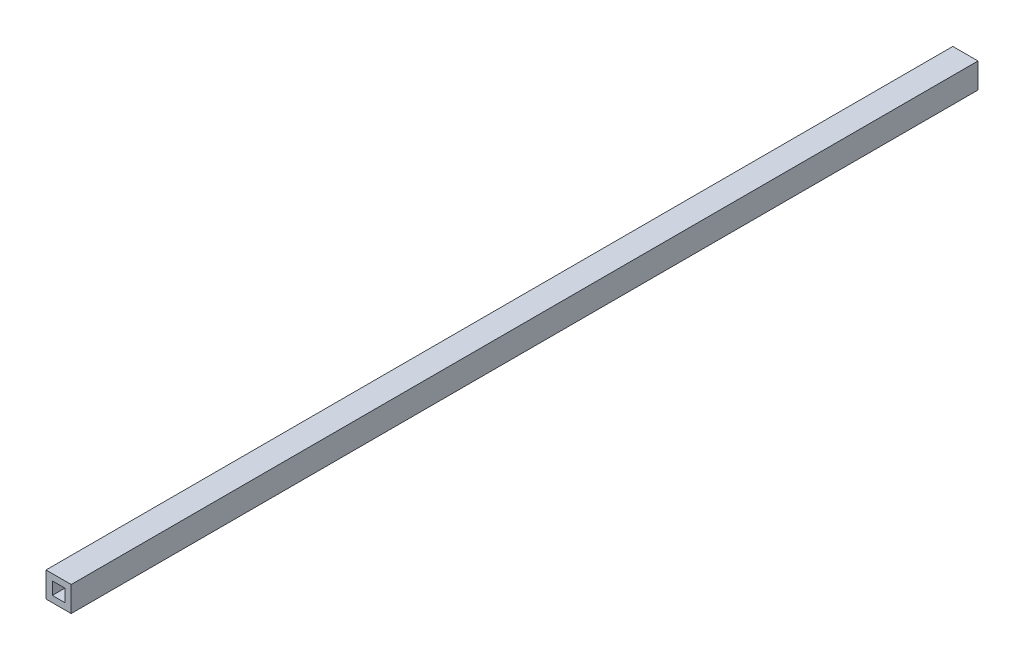
ISO-10303-21;
HEADER;
FILE_DESCRIPTION(('STEP AP214'),'2;1');
FILE_NAME('part.step','',(''),(''),'','','');
FILE_SCHEMA(('AUTOMOTIVE_DESIGN { 1 0 10303 214 1 1 1 1 }'));
ENDSEC;
DATA;
#1=APPLICATION_CONTEXT('core data for automotive mechanical design processes');
#2=APPLICATION_PROTOCOL_DEFINITION('international standard','automotive_design',2000,#1);
#3=PRODUCT_CONTEXT('',#1,'mechanical');
#4=PRODUCT('Part','Part','',(#3));
#5=PRODUCT_RELATED_PRODUCT_CATEGORY('part','',(#4));
#6=PRODUCT_DEFINITION_FORMATION('','',#4);
#7=PRODUCT_DEFINITION_CONTEXT('part definition',#1,'design');
#8=PRODUCT_DEFINITION('design','',#6,#7);
#9=PRODUCT_DEFINITION_SHAPE('','',#8);
#10=(LENGTH_UNIT() NAMED_UNIT(*) SI_UNIT(.MILLI.,.METRE.));
#11=(NAMED_UNIT(*) PLANE_ANGLE_UNIT() SI_UNIT($,.RADIAN.));
#12=(NAMED_UNIT(*) SI_UNIT($,.STERADIAN.) SOLID_ANGLE_UNIT());
#13=UNCERTAINTY_MEASURE_WITH_UNIT(LENGTH_MEASURE(1.E-05),#10,'distance_accuracy_value','');
#14=(GEOMETRIC_REPRESENTATION_CONTEXT(3) GLOBAL_UNCERTAINTY_ASSIGNED_CONTEXT((#13)) GLOBAL_UNIT_ASSIGNED_CONTEXT((#10,
#11,#12)) REPRESENTATION_CONTEXT('',''));
#15=CARTESIAN_POINT('',(0.,0.,0.));
#16=DIRECTION('',(0.,0.,1.));
#17=DIRECTION('',(1.,0.,0.));
#18=AXIS2_PLACEMENT_3D('',#15,#16,#17);
#19=CARTESIAN_POINT('',(25.4,-12.7000000000001,457.200000000001));
#20=DIRECTION('',(0.,0.,-1.));
#21=DIRECTION('',(-1.,0.,0.));
#22=AXIS2_PLACEMENT_3D('',#19,#20,#21);
#23=PLANE('',#22);
#24=DIRECTION('',(-1.,0.,0.));
#25=VECTOR('',#24,1.);
#26=CARTESIAN_POINT('',(6.35,6.35,457.200000000001));
#27=LINE('',#26,#25);
#28=CARTESIAN_POINT('',(19.05,6.35,457.200000000001));
#29=VERTEX_POINT('',#28);
#30=CARTESIAN_POINT('',(6.35,6.35,457.200000000001));
#31=VERTEX_POINT('',#30);
#32=EDGE_CURVE('E124',#29,#31,#27,.T.);
#33=ORIENTED_EDGE('',*,*,#32,.F.);
#34=DIRECTION('',(0.,1.,0.));
#35=VECTOR('',#34,1.);
#36=CARTESIAN_POINT('',(19.05,-6.35,457.200000000001));
#37=LINE('',#36,#35);
#38=CARTESIAN_POINT('',(19.05,-6.35,457.200000000001));
#39=VERTEX_POINT('',#38);
#40=EDGE_CURVE('E47',#39,#29,#37,.T.);
#41=ORIENTED_EDGE('',*,*,#40,.F.);
#42=DIRECTION('',(1.,0.,0.));
#43=VECTOR('',#42,1.);
#44=CARTESIAN_POINT('',(6.35,-6.35,457.200000000001));
#45=LINE('',#44,#43);
#46=CARTESIAN_POINT('',(6.35,-6.35,457.200000000001));
#47=VERTEX_POINT('',#46);
#48=EDGE_CURVE('E115',#47,#39,#45,.T.);
#49=ORIENTED_EDGE('',*,*,#48,.F.);
#50=DIRECTION('',(0.,-1.,0.));
#51=VECTOR('',#50,1.);
#52=CARTESIAN_POINT('',(6.35,-6.35,457.200000000001));
#53=LINE('',#52,#51);
#54=EDGE_CURVE('E118',#31,#47,#53,.T.);
#55=ORIENTED_EDGE('',*,*,#54,.F.);
#56=EDGE_LOOP('',(#33,#41,#49,#55));
#57=FACE_BOUND('',#56,.T.);
#58=DIRECTION('',(0.,-1.,0.));
#59=VECTOR('',#58,1.);
#60=CARTESIAN_POINT('',(0.,-12.7000000000001,457.200000000001));
#61=LINE('',#60,#59);
#62=CARTESIAN_POINT('',(0.,12.6999999999999,457.200000000001));
#63=VERTEX_POINT('',#62);
#64=CARTESIAN_POINT('',(0.,-12.7000000000001,457.200000000001));
#65=VERTEX_POINT('',#64);
#66=EDGE_CURVE('E130',#63,#65,#61,.T.);
#67=ORIENTED_EDGE('',*,*,#66,.T.);
#68=DIRECTION('',(-1.,0.,0.));
#69=VECTOR('',#68,1.);
#70=CARTESIAN_POINT('',(25.4,-12.7000000000001,457.200000000001));
#71=LINE('',#70,#69);
#72=CARTESIAN_POINT('',(25.4,-12.7000000000001,457.200000000001));
#73=VERTEX_POINT('',#72);
#74=EDGE_CURVE('E11',#73,#65,#71,.T.);
#75=ORIENTED_EDGE('',*,*,#74,.F.);
#76=DIRECTION('',(0.,-1.,0.));
#77=VECTOR('',#76,1.);
#78=CARTESIAN_POINT('',(25.4,-12.7000000000001,457.200000000001));
#79=LINE('',#78,#77);
#80=CARTESIAN_POINT('',(25.4,12.6999999999999,457.200000000001));
#81=VERTEX_POINT('',#80);
#82=EDGE_CURVE('E134',#81,#73,#79,.T.);
#83=ORIENTED_EDGE('',*,*,#82,.F.);
#84=DIRECTION('',(-1.,0.,0.));
#85=VECTOR('',#84,1.);
#86=CARTESIAN_POINT('',(25.4,12.6999999999999,457.200000000001));
#87=LINE('',#86,#85);
#88=EDGE_CURVE('E144',#81,#63,#87,.T.);
#89=ORIENTED_EDGE('',*,*,#88,.T.);
#90=EDGE_LOOP('',(#67,#75,#83,#89));
#91=FACE_BOUND('',#90,.T.);
#92=ADVANCED_FACE('F33',(#57,#91),#23,.F.);
#93=CARTESIAN_POINT('',(25.4,-12.6999999999999,-457.199999999999));
#94=DIRECTION('',(0.,1.,0.));
#95=DIRECTION('',(0.,0.,1.));
#96=AXIS2_PLACEMENT_3D('',#93,#94,#95);
#97=PLANE('',#96);
#98=DIRECTION('',(0.,0.,-1.));
#99=VECTOR('',#98,1.);
#100=CARTESIAN_POINT('',(0.,-12.6999999999999,-457.199999999999));
#101=LINE('',#100,#99);
#102=CARTESIAN_POINT('',(0.,-12.6999999999999,-457.199999999999));
#103=VERTEX_POINT('',#102);
#104=EDGE_CURVE('E147',#65,#103,#101,.T.);
#105=ORIENTED_EDGE('',*,*,#104,.T.);
#106=DIRECTION('',(-1.,0.,0.));
#107=VECTOR('',#106,1.);
#108=CARTESIAN_POINT('',(25.4,-12.6999999999999,-457.199999999999));
#109=LINE('',#108,#107);
#110=CARTESIAN_POINT('',(25.4,-12.6999999999999,-457.199999999999));
#111=VERTEX_POINT('',#110);
#112=EDGE_CURVE('E40',#111,#103,#109,.T.);
#113=ORIENTED_EDGE('',*,*,#112,.F.);
#114=DIRECTION('',(0.,0.,-1.));
#115=VECTOR('',#114,1.);
#116=CARTESIAN_POINT('',(25.4,-12.6999999999999,-457.199999999999));
#117=LINE('',#116,#115);
#118=EDGE_CURVE('E137',#73,#111,#117,.T.);
#119=ORIENTED_EDGE('',*,*,#118,.F.);
#120=ORIENTED_EDGE('',*,*,#74,.T.);
#121=EDGE_LOOP('',(#105,#113,#119,#120));
#122=FACE_BOUND('',#121,.T.);
#123=ADVANCED_FACE('F175',(#122),#97,.F.);
#124=CARTESIAN_POINT('',(25.4,-12.6999999999999,-457.199999999999));
#125=DIRECTION('',(0.,0.,1.));
#126=DIRECTION('',(1.,0.,0.));
#127=AXIS2_PLACEMENT_3D('',#124,#125,#126);
#128=PLANE('',#127);
#129=DIRECTION('',(1.,0.,0.));
#130=VECTOR('',#129,1.);
#131=CARTESIAN_POINT('',(6.35,-6.35,-457.199999999999));
#132=LINE('',#131,#130);
#133=CARTESIAN_POINT('',(6.35,-6.35,-457.199999999999));
#134=VERTEX_POINT('',#133);
#135=CARTESIAN_POINT('',(19.05,-6.35,-457.199999999999));
#136=VERTEX_POINT('',#135);
#137=EDGE_CURVE('E105',#134,#136,#132,.T.);
#138=ORIENTED_EDGE('',*,*,#137,.T.);
#139=DIRECTION('',(0.,1.,0.));
#140=VECTOR('',#139,1.);
#141=CARTESIAN_POINT('',(19.05,-6.35,-457.199999999999));
#142=LINE('',#141,#140);
#143=CARTESIAN_POINT('',(19.05,6.35,-457.199999999999));
#144=VERTEX_POINT('',#143);
#145=EDGE_CURVE('E99',#136,#144,#142,.T.);
#146=ORIENTED_EDGE('',*,*,#145,.T.);
#147=DIRECTION('',(-1.,0.,0.));
#148=VECTOR('',#147,1.);
#149=CARTESIAN_POINT('',(6.35,6.35,-457.199999999999));
#150=LINE('',#149,#148);
#151=CARTESIAN_POINT('',(6.35,6.35,-457.199999999999));
#152=VERTEX_POINT('',#151);
#153=EDGE_CURVE('E108',#144,#152,#150,.T.);
#154=ORIENTED_EDGE('',*,*,#153,.T.);
#155=DIRECTION('',(0.,-1.,0.));
#156=VECTOR('',#155,1.);
#157=CARTESIAN_POINT('',(6.35,-6.35,-457.199999999999));
#158=LINE('',#157,#156);
#159=EDGE_CURVE('E55',#152,#134,#158,.T.);
#160=ORIENTED_EDGE('',*,*,#159,.T.);
#161=EDGE_LOOP('',(#138,#146,#154,#160));
#162=FACE_BOUND('',#161,.T.);
#163=DIRECTION('',(0.,1.,0.));
#164=VECTOR('',#163,1.);
#165=CARTESIAN_POINT('',(0.,-12.6999999999999,-457.199999999999));
#166=LINE('',#165,#164);
#167=CARTESIAN_POINT('',(0.,12.7000000000001,-457.199999999999));
#168=VERTEX_POINT('',#167);
#169=EDGE_CURVE('E149',#103,#168,#166,.T.);
#170=ORIENTED_EDGE('',*,*,#169,.T.);
#171=DIRECTION('',(-1.,0.,0.));
#172=VECTOR('',#171,1.);
#173=CARTESIAN_POINT('',(25.4,12.7000000000001,-457.199999999999));
#174=LINE('',#173,#172);
#175=CARTESIAN_POINT('',(25.4,12.7000000000001,-457.199999999999));
#176=VERTEX_POINT('',#175);
#177=EDGE_CURVE('E154',#176,#168,#174,.T.);
#178=ORIENTED_EDGE('',*,*,#177,.F.);
#179=DIRECTION('',(0.,1.,0.));
#180=VECTOR('',#179,1.);
#181=CARTESIAN_POINT('',(25.4,-12.6999999999999,-457.199999999999));
#182=LINE('',#181,#180);
#183=EDGE_CURVE('E140',#111,#176,#182,.T.);
#184=ORIENTED_EDGE('',*,*,#183,.F.);
#185=ORIENTED_EDGE('',*,*,#112,.T.);
#186=EDGE_LOOP('',(#170,#178,#184,#185));
#187=FACE_BOUND('',#186,.T.);
#188=ADVANCED_FACE('F112',(#162,#187),#128,.F.);
#189=CARTESIAN_POINT('',(25.4,12.7000000000001,-457.199999999999));
#190=DIRECTION('',(0.,-1.,0.));
#191=DIRECTION('',(0.,0.,-1.));
#192=AXIS2_PLACEMENT_3D('',#189,#190,#191);
#193=PLANE('',#192);
#194=DIRECTION('',(0.,0.,1.));
#195=VECTOR('',#194,1.);
#196=CARTESIAN_POINT('',(0.,12.7000000000001,-457.199999999999));
#197=LINE('',#196,#195);
#198=EDGE_CURVE('E138',#168,#63,#197,.T.);
#199=ORIENTED_EDGE('',*,*,#198,.T.);
#200=ORIENTED_EDGE('',*,*,#88,.F.);
#201=DIRECTION('',(0.,0.,1.));
#202=VECTOR('',#201,1.);
#203=CARTESIAN_POINT('',(25.4,12.7000000000001,-457.199999999999));
#204=LINE('',#203,#202);
#205=EDGE_CURVE('E142',#176,#81,#204,.T.);
#206=ORIENTED_EDGE('',*,*,#205,.F.);
#207=ORIENTED_EDGE('',*,*,#177,.T.);
#208=EDGE_LOOP('',(#199,#200,#206,#207));
#209=FACE_BOUND('',#208,.T.);
#210=ADVANCED_FACE('F168',(#209),#193,.F.);
#211=CARTESIAN_POINT('',(25.4,0.,0.));
#212=DIRECTION('',(1.,0.,0.));
#213=DIRECTION('',(0.,0.,-1.));
#214=AXIS2_PLACEMENT_3D('',#211,#212,#213);
#215=PLANE('',#214);
#216=ORIENTED_EDGE('',*,*,#82,.T.);
#217=ORIENTED_EDGE('',*,*,#118,.T.);
#218=ORIENTED_EDGE('',*,*,#183,.T.);
#219=ORIENTED_EDGE('',*,*,#205,.T.);
#220=EDGE_LOOP('',(#216,#217,#218,#219));
#221=FACE_BOUND('',#220,.T.);
#222=ADVANCED_FACE('F174',(#221),#215,.T.);
#223=CARTESIAN_POINT('',(0.,0.,0.));
#224=DIRECTION('',(1.,0.,0.));
#225=DIRECTION('',(0.,0.,-1.));
#226=AXIS2_PLACEMENT_3D('',#223,#224,#225);
#227=PLANE('',#226);
#228=ORIENTED_EDGE('',*,*,#66,.F.);
#229=ORIENTED_EDGE('',*,*,#198,.F.);
#230=ORIENTED_EDGE('',*,*,#169,.F.);
#231=ORIENTED_EDGE('',*,*,#104,.F.);
#232=EDGE_LOOP('',(#228,#229,#230,#231));
#233=FACE_BOUND('',#232,.T.);
#234=ADVANCED_FACE('F165',(#233),#227,.F.);
#235=CARTESIAN_POINT('',(19.05,-6.35,-457.199999999999));
#236=DIRECTION('',(1.,0.,0.));
#237=DIRECTION('',(0.,0.,-1.));
#238=AXIS2_PLACEMENT_3D('',#235,#236,#237);
#239=PLANE('',#238);
#240=ORIENTED_EDGE('',*,*,#40,.T.);
#241=DIRECTION('',(0.,0.,1.));
#242=VECTOR('',#241,1.);
#243=CARTESIAN_POINT('',(19.05,6.35,-457.199999999999));
#244=LINE('',#243,#242);
#245=EDGE_CURVE('E95',#144,#29,#244,.T.);
#246=ORIENTED_EDGE('',*,*,#245,.F.);
#247=ORIENTED_EDGE('',*,*,#145,.F.);
#248=DIRECTION('',(0.,0.,1.));
#249=VECTOR('',#248,1.);
#250=CARTESIAN_POINT('',(19.05,-6.35,-457.199999999999));
#251=LINE('',#250,#249);
#252=EDGE_CURVE('E128',#136,#39,#251,.T.);
#253=ORIENTED_EDGE('',*,*,#252,.T.);
#254=EDGE_LOOP('',(#240,#246,#247,#253));
#255=FACE_BOUND('',#254,.T.);
#256=ADVANCED_FACE('F97',(#255),#239,.F.);
#257=CARTESIAN_POINT('',(6.35,-6.35,-457.199999999999));
#258=DIRECTION('',(0.,-1.,0.));
#259=DIRECTION('',(0.,0.,-1.));
#260=AXIS2_PLACEMENT_3D('',#257,#258,#259);
#261=PLANE('',#260);
#262=ORIENTED_EDGE('',*,*,#48,.T.);
#263=ORIENTED_EDGE('',*,*,#252,.F.);
#264=ORIENTED_EDGE('',*,*,#137,.F.);
#265=DIRECTION('',(0.,0.,1.));
#266=VECTOR('',#265,1.);
#267=CARTESIAN_POINT('',(6.35,-6.35,-457.199999999999));
#268=LINE('',#267,#266);
#269=EDGE_CURVE('E131',#134,#47,#268,.T.);
#270=ORIENTED_EDGE('',*,*,#269,.T.);
#271=EDGE_LOOP('',(#262,#263,#264,#270));
#272=FACE_BOUND('',#271,.T.);
#273=ADVANCED_FACE('F192',(#272),#261,.F.);
#274=CARTESIAN_POINT('',(6.35,-6.35,-457.199999999999));
#275=DIRECTION('',(-1.,0.,0.));
#276=DIRECTION('',(0.,0.,1.));
#277=AXIS2_PLACEMENT_3D('',#274,#275,#276);
#278=PLANE('',#277);
#279=ORIENTED_EDGE('',*,*,#54,.T.);
#280=ORIENTED_EDGE('',*,*,#269,.F.);
#281=ORIENTED_EDGE('',*,*,#159,.F.);
#282=DIRECTION('',(0.,0.,1.));
#283=VECTOR('',#282,1.);
#284=CARTESIAN_POINT('',(6.35,6.35,-457.199999999999));
#285=LINE('',#284,#283);
#286=EDGE_CURVE('E104',#152,#31,#285,.T.);
#287=ORIENTED_EDGE('',*,*,#286,.T.);
#288=EDGE_LOOP('',(#279,#280,#281,#287));
#289=FACE_BOUND('',#288,.T.);
#290=ADVANCED_FACE('F195',(#289),#278,.F.);
#291=CARTESIAN_POINT('',(6.35,6.35,-457.199999999999));
#292=DIRECTION('',(0.,1.,0.));
#293=DIRECTION('',(0.,0.,1.));
#294=AXIS2_PLACEMENT_3D('',#291,#292,#293);
#295=PLANE('',#294);
#296=ORIENTED_EDGE('',*,*,#32,.T.);
#297=ORIENTED_EDGE('',*,*,#286,.F.);
#298=ORIENTED_EDGE('',*,*,#153,.F.);
#299=ORIENTED_EDGE('',*,*,#245,.T.);
#300=EDGE_LOOP('',(#296,#297,#298,#299));
#301=FACE_BOUND('',#300,.T.);
#302=ADVANCED_FACE('F109',(#301),#295,.F.);
#303=CLOSED_SHELL('',(#92,#123,#188,#210,#222,#234,#256,#273,#290,#302));
#304=MANIFOLD_SOLID_BREP('B2',#303);
#305=ADVANCED_BREP_SHAPE_REPRESENTATION('',(#18,#304),#14);
#306=SHAPE_DEFINITION_REPRESENTATION(#9,#305);
ENDSEC;
END-ISO-10303-21;
